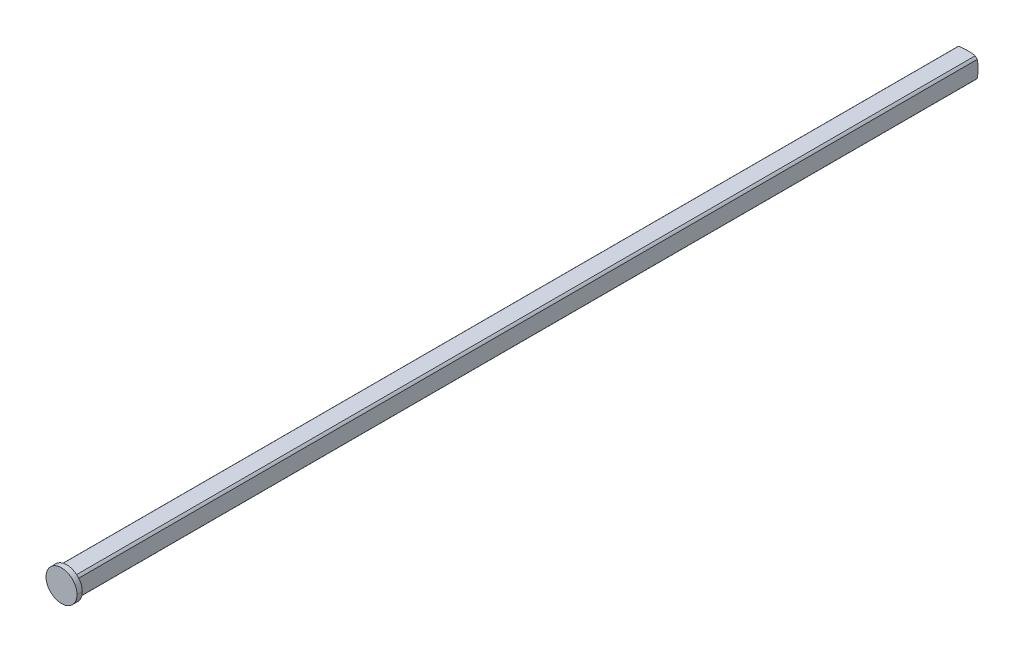
ISO-10303-21;
HEADER;
FILE_DESCRIPTION(('STEP AP214'),'2;1');
FILE_NAME('part.step','',(''),(''),'','','');
FILE_SCHEMA(('AUTOMOTIVE_DESIGN { 1 0 10303 214 1 1 1 1 }'));
ENDSEC;
DATA;
#1=APPLICATION_CONTEXT('core data for automotive mechanical design processes');
#2=APPLICATION_PROTOCOL_DEFINITION('international standard','automotive_design',2000,#1);
#3=PRODUCT_CONTEXT('',#1,'mechanical');
#4=PRODUCT('Part','Part','',(#3));
#5=PRODUCT_RELATED_PRODUCT_CATEGORY('part','',(#4));
#6=PRODUCT_DEFINITION_FORMATION('','',#4);
#7=PRODUCT_DEFINITION_CONTEXT('part definition',#1,'design');
#8=PRODUCT_DEFINITION('design','',#6,#7);
#9=PRODUCT_DEFINITION_SHAPE('','',#8);
#10=(LENGTH_UNIT() NAMED_UNIT(*) SI_UNIT(.MILLI.,.METRE.));
#11=(NAMED_UNIT(*) PLANE_ANGLE_UNIT() SI_UNIT($,.RADIAN.));
#12=(NAMED_UNIT(*) SI_UNIT($,.STERADIAN.) SOLID_ANGLE_UNIT());
#13=UNCERTAINTY_MEASURE_WITH_UNIT(LENGTH_MEASURE(1.E-05),#10,'distance_accuracy_value','');
#14=(GEOMETRIC_REPRESENTATION_CONTEXT(3) GLOBAL_UNCERTAINTY_ASSIGNED_CONTEXT((#13)) GLOBAL_UNIT_ASSIGNED_CONTEXT((#10,
#11,#12)) REPRESENTATION_CONTEXT('',''));
#15=CARTESIAN_POINT('',(0.,0.,0.));
#16=DIRECTION('',(0.,0.,1.));
#17=DIRECTION('',(1.,0.,0.));
#18=AXIS2_PLACEMENT_3D('',#15,#16,#17);
#19=CARTESIAN_POINT('',(0.,0.,0.));
#20=DIRECTION('',(0.,0.,1.));
#21=DIRECTION('',(1.,0.,0.));
#22=AXIS2_PLACEMENT_3D('',#19,#20,#21);
#23=PLANE('',#22);
#24=CARTESIAN_POINT('',(0.,0.,0.));
#25=DIRECTION('',(0.,0.,1.));
#26=DIRECTION('',(1.,0.,0.));
#27=AXIS2_PLACEMENT_3D('',#24,#25,#26);
#28=CIRCLE('',#27,2.375);
#29=CARTESIAN_POINT('',(-2.375,0.,0.));
#30=VERTEX_POINT('',#29);
#31=CARTESIAN_POINT('',(2.375,0.,0.));
#32=VERTEX_POINT('',#31);
#33=EDGE_CURVE('P0_E11',#30,#32,#28,.T.);
#34=ORIENTED_EDGE('',*,*,#33,.F.);
#35=CARTESIAN_POINT('',(0.,0.,0.));
#36=DIRECTION('',(0.,0.,1.));
#37=DIRECTION('',(1.,0.,0.));
#38=AXIS2_PLACEMENT_3D('',#35,#36,#37);
#39=CIRCLE('',#38,2.375);
#40=EDGE_CURVE('P0_E69',#32,#30,#39,.T.);
#41=ORIENTED_EDGE('',*,*,#40,.F.);
#42=EDGE_LOOP('',(#34,#41));
#43=FACE_BOUND('',#42,.T.);
#44=ADVANCED_FACE('P0_F17',(#43),#23,.F.);
#45=CARTESIAN_POINT('',(0.,0.,0.8));
#46=DIRECTION('',(0.,0.,1.));
#47=DIRECTION('',(1.,0.,0.));
#48=AXIS2_PLACEMENT_3D('',#45,#46,#47);
#49=PLANE('',#48);
#50=CARTESIAN_POINT('',(0.,0.,0.8));
#51=DIRECTION('',(0.,0.,1.));
#52=DIRECTION('',(1.,0.,0.));
#53=AXIS2_PLACEMENT_3D('',#50,#51,#52);
#54=CIRCLE('',#53,2.375);
#55=CARTESIAN_POINT('',(-2.375,0.,0.8));
#56=VERTEX_POINT('',#55);
#57=CARTESIAN_POINT('',(2.375,0.,0.8));
#58=VERTEX_POINT('',#57);
#59=EDGE_CURVE('P0_E29',#56,#58,#54,.T.);
#60=ORIENTED_EDGE('',*,*,#59,.T.);
#61=CARTESIAN_POINT('',(0.,0.,0.8));
#62=DIRECTION('',(0.,0.,1.));
#63=DIRECTION('',(1.,0.,0.));
#64=AXIS2_PLACEMENT_3D('',#61,#62,#63);
#65=CIRCLE('',#64,2.375);
#66=EDGE_CURVE('P0_E21',#58,#56,#65,.T.);
#67=ORIENTED_EDGE('',*,*,#66,.T.);
#68=EDGE_LOOP('',(#60,#67));
#69=FACE_BOUND('',#68,.T.);
#70=ADVANCED_FACE('P0_F59',(#69),#49,.T.);
#71=CARTESIAN_POINT('',(0.,0.,0.8));
#72=DIRECTION('',(0.,0.,-1.));
#73=DIRECTION('',(-1.,0.,0.));
#74=AXIS2_PLACEMENT_3D('',#71,#72,#73);
#75=CYLINDRICAL_SURFACE('',#74,2.375);
#76=DIRECTION('',(0.,0.,-1.));
#77=VECTOR('',#76,1.);
#78=CARTESIAN_POINT('',(2.375,0.,0.8));
#79=LINE('',#78,#77);
#80=EDGE_CURVE('P0_E63',#58,#32,#79,.T.);
#81=ORIENTED_EDGE('',*,*,#80,.F.);
#82=ORIENTED_EDGE('',*,*,#59,.F.);
#83=DIRECTION('',(0.,0.,-1.));
#84=VECTOR('',#83,1.);
#85=CARTESIAN_POINT('',(-2.375,0.,0.8));
#86=LINE('',#85,#84);
#87=EDGE_CURVE('P0_E61',#56,#30,#86,.T.);
#88=ORIENTED_EDGE('',*,*,#87,.T.);
#89=ORIENTED_EDGE('',*,*,#33,.T.);
#90=EDGE_LOOP('',(#81,#82,#88,#89));
#91=FACE_BOUND('',#90,.T.);
#92=ADVANCED_FACE('P0_F19',(#91),#75,.T.);
#93=CARTESIAN_POINT('',(0.,0.,0.8));
#94=DIRECTION('',(0.,0.,-1.));
#95=DIRECTION('',(-1.,0.,0.));
#96=AXIS2_PLACEMENT_3D('',#93,#94,#95);
#97=CYLINDRICAL_SURFACE('',#96,2.375);
#98=ORIENTED_EDGE('',*,*,#66,.F.);
#99=ORIENTED_EDGE('',*,*,#80,.T.);
#100=ORIENTED_EDGE('',*,*,#40,.T.);
#101=ORIENTED_EDGE('',*,*,#87,.F.);
#102=EDGE_LOOP('',(#98,#99,#100,#101));
#103=FACE_BOUND('',#102,.T.);
#104=ADVANCED_FACE('P0_F68',(#103),#97,.T.);
#105=CLOSED_SHELL('',(#44,#70,#92,#104));
#106=MANIFOLD_SOLID_BREP('P0_B1',#105);
#107=CARTESIAN_POINT('',(0.,0.,-137.922));
#108=DIRECTION('',(0.,0.,1.));
#109=DIRECTION('',(1.,0.,0.));
#110=AXIS2_PLACEMENT_3D('',#107,#108,#109);
#111=CYLINDRICAL_SURFACE('',#110,2.032);
#112=DIRECTION('',(0.,0.,-1.));
#113=VECTOR('',#112,1.);
#114=CARTESIAN_POINT('',(1.5875,1.26841150657032,-137.922));
#115=LINE('',#114,#113);
#116=CARTESIAN_POINT('',(1.5875,1.26841150657032,0.));
#117=VERTEX_POINT('',#116);
#118=CARTESIAN_POINT('',(1.5875,1.26841150657033,-137.770919142098));
#119=VERTEX_POINT('',#118);
#120=EDGE_CURVE('P1_E214',#117,#119,#115,.T.);
#121=ORIENTED_EDGE('',*,*,#120,.T.);
#122=CARTESIAN_POINT('',(0.,0.,-137.770919142098));
#123=DIRECTION('',(0.,0.,1.));
#124=DIRECTION('',(1.,0.,0.));
#125=AXIS2_PLACEMENT_3D('',#122,#123,#124);
#126=CIRCLE('',#125,2.032);
#127=CARTESIAN_POINT('',(1.26841150657032,1.5875,-137.770919142098));
#128=VERTEX_POINT('',#127);
#129=EDGE_CURVE('P1_E272',#119,#128,#126,.T.);
#130=ORIENTED_EDGE('',*,*,#129,.T.);
#131=DIRECTION('',(0.,0.,1.));
#132=VECTOR('',#131,1.);
#133=CARTESIAN_POINT('',(1.26841150657032,1.5875,-137.922));
#134=LINE('',#133,#132);
#135=CARTESIAN_POINT('',(1.26841150657032,1.5875,0.));
#136=VERTEX_POINT('',#135);
#137=EDGE_CURVE('P1_E172',#128,#136,#134,.T.);
#138=ORIENTED_EDGE('',*,*,#137,.T.);
#139=CARTESIAN_POINT('',(0.,0.,0.));
#140=DIRECTION('',(0.,0.,1.));
#141=DIRECTION('',(1.,0.,0.));
#142=AXIS2_PLACEMENT_3D('',#139,#140,#141);
#143=CIRCLE('',#142,2.032);
#144=EDGE_CURVE('P1_E208',#117,#136,#143,.T.);
#145=ORIENTED_EDGE('',*,*,#144,.F.);
#146=EDGE_LOOP('',(#121,#130,#138,#145));
#147=FACE_BOUND('',#146,.T.);
#148=ADVANCED_FACE('P1_F16',(#147),#111,.T.);
#149=CARTESIAN_POINT('',(0.,0.,-137.922));
#150=DIRECTION('',(0.,0.,1.));
#151=DIRECTION('',(1.,0.,0.));
#152=AXIS2_PLACEMENT_3D('',#149,#150,#151);
#153=CYLINDRICAL_SURFACE('',#152,2.032);
#154=DIRECTION('',(0.,0.,1.));
#155=VECTOR('',#154,1.);
#156=CARTESIAN_POINT('',(-1.5875,1.26841150657032,-137.922));
#157=LINE('',#156,#155);
#158=CARTESIAN_POINT('',(-1.5875,1.26841150657032,-137.770919142098));
#159=VERTEX_POINT('',#158);
#160=CARTESIAN_POINT('',(-1.5875,1.26841150657032,0.));
#161=VERTEX_POINT('',#160);
#162=EDGE_CURVE('P1_E108',#159,#161,#157,.T.);
#163=ORIENTED_EDGE('',*,*,#162,.T.);
#164=CARTESIAN_POINT('',(0.,0.,0.));
#165=DIRECTION('',(0.,0.,1.));
#166=DIRECTION('',(1.,0.,0.));
#167=AXIS2_PLACEMENT_3D('',#164,#165,#166);
#168=CIRCLE('',#167,2.032);
#169=CARTESIAN_POINT('',(-1.26841150657032,1.5875,0.));
#170=VERTEX_POINT('',#169);
#171=EDGE_CURVE('P1_E43',#170,#161,#168,.T.);
#172=ORIENTED_EDGE('',*,*,#171,.F.);
#173=DIRECTION('',(0.,0.,-1.));
#174=VECTOR('',#173,1.);
#175=CARTESIAN_POINT('',(-1.26841150657032,1.5875,-137.922));
#176=LINE('',#175,#174);
#177=CARTESIAN_POINT('',(-1.26841150657033,1.5875,-137.770919142098));
#178=VERTEX_POINT('',#177);
#179=EDGE_CURVE('P1_E130',#170,#178,#176,.T.);
#180=ORIENTED_EDGE('',*,*,#179,.T.);
#181=CARTESIAN_POINT('',(0.,0.,-137.770919142098));
#182=DIRECTION('',(0.,0.,1.));
#183=DIRECTION('',(1.,0.,0.));
#184=AXIS2_PLACEMENT_3D('',#181,#182,#183);
#185=CIRCLE('',#184,2.032);
#186=EDGE_CURVE('P1_E123',#178,#159,#185,.T.);
#187=ORIENTED_EDGE('',*,*,#186,.T.);
#188=EDGE_LOOP('',(#163,#172,#180,#187));
#189=FACE_BOUND('',#188,.T.);
#190=ADVANCED_FACE('P1_F122',(#189),#153,.T.);
#191=CARTESIAN_POINT('',(0.,0.,-137.922));
#192=DIRECTION('',(0.,0.,1.));
#193=DIRECTION('',(1.,0.,0.));
#194=AXIS2_PLACEMENT_3D('',#191,#192,#193);
#195=CYLINDRICAL_SURFACE('',#194,2.032);
#196=DIRECTION('',(0.,0.,-1.));
#197=VECTOR('',#196,1.);
#198=CARTESIAN_POINT('',(-1.5875,-1.26841150657032,-137.922));
#199=LINE('',#198,#197);
#200=CARTESIAN_POINT('',(-1.5875,-1.26841150657032,0.));
#201=VERTEX_POINT('',#200);
#202=CARTESIAN_POINT('',(-1.5875,-1.26841150657033,-137.770919142098));
#203=VERTEX_POINT('',#202);
#204=EDGE_CURVE('P1_E228',#201,#203,#199,.T.);
#205=ORIENTED_EDGE('',*,*,#204,.T.);
#206=CARTESIAN_POINT('',(0.,0.,-137.770919142098));
#207=DIRECTION('',(0.,0.,1.));
#208=DIRECTION('',(1.,0.,0.));
#209=AXIS2_PLACEMENT_3D('',#206,#207,#208);
#210=CIRCLE('',#209,2.032);
#211=CARTESIAN_POINT('',(-1.26841150657032,-1.5875,-137.770919142098));
#212=VERTEX_POINT('',#211);
#213=EDGE_CURVE('P1_E10',#203,#212,#210,.T.);
#214=ORIENTED_EDGE('',*,*,#213,.T.);
#215=DIRECTION('',(0.,0.,1.));
#216=VECTOR('',#215,1.);
#217=CARTESIAN_POINT('',(-1.26841150657032,-1.5875,-137.922));
#218=LINE('',#217,#216);
#219=CARTESIAN_POINT('',(-1.26841150657032,-1.5875,0.));
#220=VERTEX_POINT('',#219);
#221=EDGE_CURVE('P1_E229',#212,#220,#218,.T.);
#222=ORIENTED_EDGE('',*,*,#221,.T.);
#223=CARTESIAN_POINT('',(0.,0.,0.));
#224=DIRECTION('',(0.,0.,1.));
#225=DIRECTION('',(1.,0.,0.));
#226=AXIS2_PLACEMENT_3D('',#223,#224,#225);
#227=CIRCLE('',#226,2.032);
#228=EDGE_CURVE('P1_E73',#201,#220,#227,.T.);
#229=ORIENTED_EDGE('',*,*,#228,.F.);
#230=EDGE_LOOP('',(#205,#214,#222,#229));
#231=FACE_BOUND('',#230,.T.);
#232=ADVANCED_FACE('P1_F156',(#231),#195,.T.);
#233=CARTESIAN_POINT('',(0.,0.,-137.922));
#234=DIRECTION('',(0.,0.,1.));
#235=DIRECTION('',(1.,0.,0.));
#236=AXIS2_PLACEMENT_3D('',#233,#234,#235);
#237=CYLINDRICAL_SURFACE('',#236,2.032);
#238=DIRECTION('',(0.,0.,-1.));
#239=VECTOR('',#238,1.);
#240=CARTESIAN_POINT('',(1.26841150657032,-1.5875,-137.922));
#241=LINE('',#240,#239);
#242=CARTESIAN_POINT('',(1.26841150657032,-1.5875,0.));
#243=VERTEX_POINT('',#242);
#244=CARTESIAN_POINT('',(1.26841150657033,-1.5875,-137.770919142098));
#245=VERTEX_POINT('',#244);
#246=EDGE_CURVE('P1_E222',#243,#245,#241,.T.);
#247=ORIENTED_EDGE('',*,*,#246,.T.);
#248=CARTESIAN_POINT('',(0.,0.,-137.770919142098));
#249=DIRECTION('',(0.,0.,1.));
#250=DIRECTION('',(1.,0.,0.));
#251=AXIS2_PLACEMENT_3D('',#248,#249,#250);
#252=CIRCLE('',#251,2.032);
#253=CARTESIAN_POINT('',(1.5875,-1.26841150657032,-137.770919142098));
#254=VERTEX_POINT('',#253);
#255=EDGE_CURVE('P1_E29',#245,#254,#252,.T.);
#256=ORIENTED_EDGE('',*,*,#255,.T.);
#257=DIRECTION('',(0.,0.,1.));
#258=VECTOR('',#257,1.);
#259=CARTESIAN_POINT('',(1.5875,-1.26841150657032,-137.922));
#260=LINE('',#259,#258);
#261=CARTESIAN_POINT('',(1.5875,-1.26841150657032,0.));
#262=VERTEX_POINT('',#261);
#263=EDGE_CURVE('P1_E219',#254,#262,#260,.T.);
#264=ORIENTED_EDGE('',*,*,#263,.T.);
#265=CARTESIAN_POINT('',(0.,0.,0.));
#266=DIRECTION('',(0.,0.,1.));
#267=DIRECTION('',(1.,0.,0.));
#268=AXIS2_PLACEMENT_3D('',#265,#266,#267);
#269=CIRCLE('',#268,2.032);
#270=EDGE_CURVE('P1_E206',#243,#262,#269,.T.);
#271=ORIENTED_EDGE('',*,*,#270,.F.);
#272=EDGE_LOOP('',(#247,#256,#264,#271));
#273=FACE_BOUND('',#272,.T.);
#274=ADVANCED_FACE('P1_F310',(#273),#237,.T.);
#275=CARTESIAN_POINT('',(-1.5875,1.5875,-137.922));
#276=DIRECTION('',(0.,0.,-1.));
#277=DIRECTION('',(0.,-1.,0.));
#278=AXIS2_PLACEMENT_3D('',#275,#276,#277);
#279=PLANE('',#278);
#280=CARTESIAN_POINT('',(0.,0.,-137.922));
#281=DIRECTION('',(0.,0.,1.));
#282=DIRECTION('',(1.,0.,0.));
#283=AXIS2_PLACEMENT_3D('',#280,#281,#282);
#284=CIRCLE('',#283,1.24506403026729);
#285=CARTESIAN_POINT('',(1.24506403026729,0.,-137.922));
#286=VERTEX_POINT('',#285);
#287=CARTESIAN_POINT('',(-1.24506403026729,0.,-137.922));
#288=VERTEX_POINT('',#287);
#289=EDGE_CURVE('P1_E207',#286,#288,#284,.T.);
#290=ORIENTED_EDGE('',*,*,#289,.F.);
#291=CARTESIAN_POINT('',(0.,0.,-137.922));
#292=DIRECTION('',(0.,0.,1.));
#293=DIRECTION('',(1.,0.,0.));
#294=AXIS2_PLACEMENT_3D('',#291,#292,#293);
#295=CIRCLE('',#294,1.24506403026729);
#296=EDGE_CURVE('P1_E202',#288,#286,#295,.T.);
#297=ORIENTED_EDGE('',*,*,#296,.F.);
#298=EDGE_LOOP('',(#290,#297));
#299=FACE_BOUND('',#298,.T.);
#300=ADVANCED_FACE('P1_F308',(#299),#279,.T.);
#301=CARTESIAN_POINT('',(0.,0.,-135.797));
#302=DIRECTION('',(0.,0.,1.));
#303=DIRECTION('',(1.,0.,0.));
#304=AXIS2_PLACEMENT_3D('',#301,#302,#303);
#305=DEGENERATE_TOROIDAL_SURFACE('',#304,1.24506403026729,2.125,.T.);
#306=CARTESIAN_POINT('',(-1.24506403026729,0.,-135.797));
#307=DIRECTION('',(0.,1.,0.));
#308=DIRECTION('',(-1.,0.,0.));
#309=AXIS2_PLACEMENT_3D('',#306,#307,#308);
#310=CIRCLE('',#309,2.125);
#311=CARTESIAN_POINT('',(-1.5875,0.,-137.894227361693));
#312=VERTEX_POINT('',#311);
#313=EDGE_CURVE('P1_E140',#288,#312,#310,.T.);
#314=ORIENTED_EDGE('',*,*,#313,.F.);
#315=ORIENTED_EDGE('',*,*,#296,.T.);
#316=CARTESIAN_POINT('',(1.24506403026729,0.,-135.797));
#317=DIRECTION('',(0.,-1.,0.));
#318=DIRECTION('',(0.,0.,-1.));
#319=AXIS2_PLACEMENT_3D('',#316,#317,#318);
#320=CIRCLE('',#319,2.125);
#321=CARTESIAN_POINT('',(1.5875,0.,-137.894227361693));
#322=VERTEX_POINT('',#321);
#323=EDGE_CURVE('P1_E121',#286,#322,#320,.T.);
#324=ORIENTED_EDGE('',*,*,#323,.T.);
#325=CARTESIAN_POINT('',(1.5875,-1.26841150657032,-137.770919142098));
#326=CARTESIAN_POINT('',(1.5875,-0.987077094901359,-137.840930639138));
#327=CARTESIAN_POINT('',(1.5875,-0.639530459017574,-137.87018195389));
#328=CARTESIAN_POINT('',(1.5875,-0.353837297484628,-137.894227361693));
#329=CARTESIAN_POINT('',(1.5875,0.,-137.894227361693));
#330=B_SPLINE_CURVE_WITH_KNOTS('',2,(#325,#326,#327,#328,#329),.UNSPECIFIED.,.F.,.F.,(3,2,3),
(0.,0.5,1.),.UNSPECIFIED.);
#331=EDGE_CURVE('P1_E240',#254,#322,#330,.T.);
#332=ORIENTED_EDGE('',*,*,#331,.F.);
#333=ORIENTED_EDGE('',*,*,#255,.F.);
#334=CARTESIAN_POINT('',(-1.26841150657032,-1.5875,-137.770919142098));
#335=CARTESIAN_POINT('',(-0.77033823220096,-1.5875,-137.894867205782));
#336=CARTESIAN_POINT('',(0.00849337593368505,-1.5875,-137.89422365179));
#337=CARTESIAN_POINT('',(0.775470990408135,-1.5875,-137.893589892836));
#338=CARTESIAN_POINT('',(1.26841150657033,-1.5875,-137.770919142098));
#339=B_SPLINE_CURVE_WITH_KNOTS('',2,(#334,#335,#336,#337,#338),.UNSPECIFIED.,.F.,.F.,(3,2,3),
(0.,0.5,1.),.UNSPECIFIED.);
#340=EDGE_CURVE('P1_E356',#212,#245,#339,.T.);
#341=ORIENTED_EDGE('',*,*,#340,.F.);
#342=ORIENTED_EDGE('',*,*,#213,.F.);
#343=CARTESIAN_POINT('',(-1.5875,0.,-137.894227361693));
#344=CARTESIAN_POINT('',(-1.5875,-0.35317995732703,-137.894227361693));
#345=CARTESIAN_POINT('',(-1.5875,-0.639529322286504,-137.870182049451));
#346=CARTESIAN_POINT('',(-1.5875,-0.986669843198608,-137.841031985792));
#347=CARTESIAN_POINT('',(-1.5875,-1.26841150657033,-137.770919142098));
#348=B_SPLINE_CURVE_WITH_KNOTS('',2,(#343,#344,#345,#346,#347),.UNSPECIFIED.,.F.,.F.,(3,2,3),
(0.,0.5,1.),.UNSPECIFIED.);
#349=EDGE_CURVE('P1_E120',#312,#203,#348,.T.);
#350=ORIENTED_EDGE('',*,*,#349,.F.);
#351=EDGE_LOOP('',(#314,#315,#324,#332,#333,#341,#342,#350));
#352=FACE_BOUND('',#351,.T.);
#353=ADVANCED_FACE('P1_F327',(#352),#305,.T.);
#354=CARTESIAN_POINT('',(-1.5875,1.5875,0.));
#355=DIRECTION('',(0.,0.,-1.));
#356=DIRECTION('',(0.,-1.,0.));
#357=AXIS2_PLACEMENT_3D('',#354,#355,#356);
#358=PLANE('',#357);
#359=ORIENTED_EDGE('',*,*,#171,.T.);
#360=DIRECTION('',(0.,-1.,0.));
#361=VECTOR('',#360,1.);
#362=CARTESIAN_POINT('',(-1.5875,-1.5875,0.));
#363=LINE('',#362,#361);
#364=EDGE_CURVE('P1_E119',#161,#201,#363,.T.);
#365=ORIENTED_EDGE('',*,*,#364,.T.);
#366=ORIENTED_EDGE('',*,*,#228,.T.);
#367=DIRECTION('',(1.,0.,0.));
#368=VECTOR('',#367,1.);
#369=CARTESIAN_POINT('',(-1.5875,-1.5875,0.));
#370=LINE('',#369,#368);
#371=EDGE_CURVE('P1_E216',#220,#243,#370,.T.);
#372=ORIENTED_EDGE('',*,*,#371,.T.);
#373=ORIENTED_EDGE('',*,*,#270,.T.);
#374=DIRECTION('',(0.,1.,0.));
#375=VECTOR('',#374,1.);
#376=CARTESIAN_POINT('',(1.5875,-1.5875,0.));
#377=LINE('',#376,#375);
#378=EDGE_CURVE('P1_E185',#262,#117,#377,.T.);
#379=ORIENTED_EDGE('',*,*,#378,.T.);
#380=ORIENTED_EDGE('',*,*,#144,.T.);
#381=DIRECTION('',(-1.,0.,0.));
#382=VECTOR('',#381,1.);
#383=CARTESIAN_POINT('',(-1.5875,1.5875,0.));
#384=LINE('',#383,#382);
#385=EDGE_CURVE('P1_E186',#136,#170,#384,.T.);
#386=ORIENTED_EDGE('',*,*,#385,.T.);
#387=EDGE_LOOP('',(#359,#365,#366,#372,#373,#379,#380,#386));
#388=FACE_BOUND('',#387,.T.);
#389=ADVANCED_FACE('P1_F251',(#388),#358,.F.);
#390=CARTESIAN_POINT('',(-1.5875,1.5875,0.));
#391=DIRECTION('',(0.,-1.,0.));
#392=DIRECTION('',(0.,0.,-1.));
#393=AXIS2_PLACEMENT_3D('',#390,#391,#392);
#394=PLANE('',#393);
#395=ORIENTED_EDGE('',*,*,#137,.F.);
#396=CARTESIAN_POINT('',(1.26841150657033,1.5875,-137.770919142098));
#397=CARTESIAN_POINT('',(0.77033823220096,1.5875,-137.894867205782));
#398=CARTESIAN_POINT('',(-0.00849337593368483,1.5875,-137.89422365179));
#399=CARTESIAN_POINT('',(-0.775470990408134,1.5875,-137.893589892836));
#400=CARTESIAN_POINT('',(-1.26841150657033,1.5875,-137.770919142098));
#401=B_SPLINE_CURVE_WITH_KNOTS('',2,(#396,#397,#398,#399,#400),.UNSPECIFIED.,.F.,.F.,(3,2,3),
(0.,0.5,1.),.UNSPECIFIED.);
#402=EDGE_CURVE('P1_E131',#128,#178,#401,.T.);
#403=ORIENTED_EDGE('',*,*,#402,.T.);
#404=ORIENTED_EDGE('',*,*,#179,.F.);
#405=ORIENTED_EDGE('',*,*,#385,.F.);
#406=EDGE_LOOP('',(#395,#403,#404,#405));
#407=FACE_BOUND('',#406,.T.);
#408=ADVANCED_FACE('P1_F252',(#407),#394,.F.);
#409=CARTESIAN_POINT('',(1.5875,-1.5875,0.));
#410=DIRECTION('',(-1.,0.,0.));
#411=DIRECTION('',(0.,0.,1.));
#412=AXIS2_PLACEMENT_3D('',#409,#410,#411);
#413=PLANE('',#412);
#414=ORIENTED_EDGE('',*,*,#263,.F.);
#415=ORIENTED_EDGE('',*,*,#331,.T.);
#416=CARTESIAN_POINT('',(1.5875,0.,-137.894227361693));
#417=CARTESIAN_POINT('',(1.5875,0.353179957326975,-137.894227361693));
#418=CARTESIAN_POINT('',(1.5875,0.639529322286505,-137.870182049451));
#419=CARTESIAN_POINT('',(1.5875,0.986669843198575,-137.841031985792));
#420=CARTESIAN_POINT('',(1.5875,1.26841150657033,-137.770919142098));
#421=B_SPLINE_CURVE_WITH_KNOTS('',2,(#416,#417,#418,#419,#420),.UNSPECIFIED.,.F.,.F.,(3,2,3),
(0.,0.5,1.),.UNSPECIFIED.);
#422=EDGE_CURVE('P1_E268',#322,#119,#421,.T.);
#423=ORIENTED_EDGE('',*,*,#422,.T.);
#424=ORIENTED_EDGE('',*,*,#120,.F.);
#425=ORIENTED_EDGE('',*,*,#378,.F.);
#426=EDGE_LOOP('',(#414,#415,#423,#424,#425));
#427=FACE_BOUND('',#426,.T.);
#428=ADVANCED_FACE('P1_F242',(#427),#413,.F.);
#429=CARTESIAN_POINT('',(-1.5875,-1.5875,0.));
#430=DIRECTION('',(0.,1.,0.));
#431=DIRECTION('',(1.,0.,0.));
#432=AXIS2_PLACEMENT_3D('',#429,#430,#431);
#433=PLANE('',#432);
#434=ORIENTED_EDGE('',*,*,#221,.F.);
#435=ORIENTED_EDGE('',*,*,#340,.T.);
#436=ORIENTED_EDGE('',*,*,#246,.F.);
#437=ORIENTED_EDGE('',*,*,#371,.F.);
#438=EDGE_LOOP('',(#434,#435,#436,#437));
#439=FACE_BOUND('',#438,.T.);
#440=ADVANCED_FACE('P1_F18',(#439),#433,.F.);
#441=CARTESIAN_POINT('',(-1.5875,-1.5875,0.));
#442=DIRECTION('',(1.,0.,0.));
#443=DIRECTION('',(0.,1.,0.));
#444=AXIS2_PLACEMENT_3D('',#441,#442,#443);
#445=PLANE('',#444);
#446=ORIENTED_EDGE('',*,*,#162,.F.);
#447=CARTESIAN_POINT('',(-1.5875,1.26841150657033,-137.770919142098));
#448=CARTESIAN_POINT('',(-1.5875,0.987077094847195,-137.840930639151));
#449=CARTESIAN_POINT('',(-1.5875,0.639530459017575,-137.87018195389));
#450=CARTESIAN_POINT('',(-1.5875,0.3538372973969,-137.894227361693));
#451=CARTESIAN_POINT('',(-1.5875,0.,-137.894227361693));
#452=B_SPLINE_CURVE_WITH_KNOTS('',2,(#447,#448,#449,#450,#451),.UNSPECIFIED.,.F.,.F.,(3,2,3),
(0.,0.5,1.),.UNSPECIFIED.);
#453=EDGE_CURVE('P1_E111',#159,#312,#452,.T.);
#454=ORIENTED_EDGE('',*,*,#453,.T.);
#455=ORIENTED_EDGE('',*,*,#349,.T.);
#456=ORIENTED_EDGE('',*,*,#204,.F.);
#457=ORIENTED_EDGE('',*,*,#364,.F.);
#458=EDGE_LOOP('',(#446,#454,#455,#456,#457));
#459=FACE_BOUND('',#458,.T.);
#460=ADVANCED_FACE('P1_F112',(#459),#445,.F.);
#461=CARTESIAN_POINT('',(0.,0.,-135.797));
#462=DIRECTION('',(0.,0.,1.));
#463=DIRECTION('',(1.,0.,0.));
#464=AXIS2_PLACEMENT_3D('',#461,#462,#463);
#465=DEGENERATE_TOROIDAL_SURFACE('',#464,1.24506403026729,2.125,.T.);
#466=ORIENTED_EDGE('',*,*,#289,.T.);
#467=ORIENTED_EDGE('',*,*,#313,.T.);
#468=ORIENTED_EDGE('',*,*,#453,.F.);
#469=ORIENTED_EDGE('',*,*,#186,.F.);
#470=ORIENTED_EDGE('',*,*,#402,.F.);
#471=ORIENTED_EDGE('',*,*,#129,.F.);
#472=ORIENTED_EDGE('',*,*,#422,.F.);
#473=ORIENTED_EDGE('',*,*,#323,.F.);
#474=EDGE_LOOP('',(#466,#467,#468,#469,#470,#471,#472,#473));
#475=FACE_BOUND('',#474,.T.);
#476=ADVANCED_FACE('P1_F134',(#475),#465,.T.);
#477=CLOSED_SHELL('',(#148,#190,#232,#274,#300,#353,#389,#408,#428,#440,#460,#476));
#478=MANIFOLD_SOLID_BREP('P1_B1',#477);
#479=ADVANCED_BREP_SHAPE_REPRESENTATION('',(#18,#106,#478),#14);
#480=SHAPE_DEFINITION_REPRESENTATION(#9,#479);
ENDSEC;
END-ISO-10303-21;
